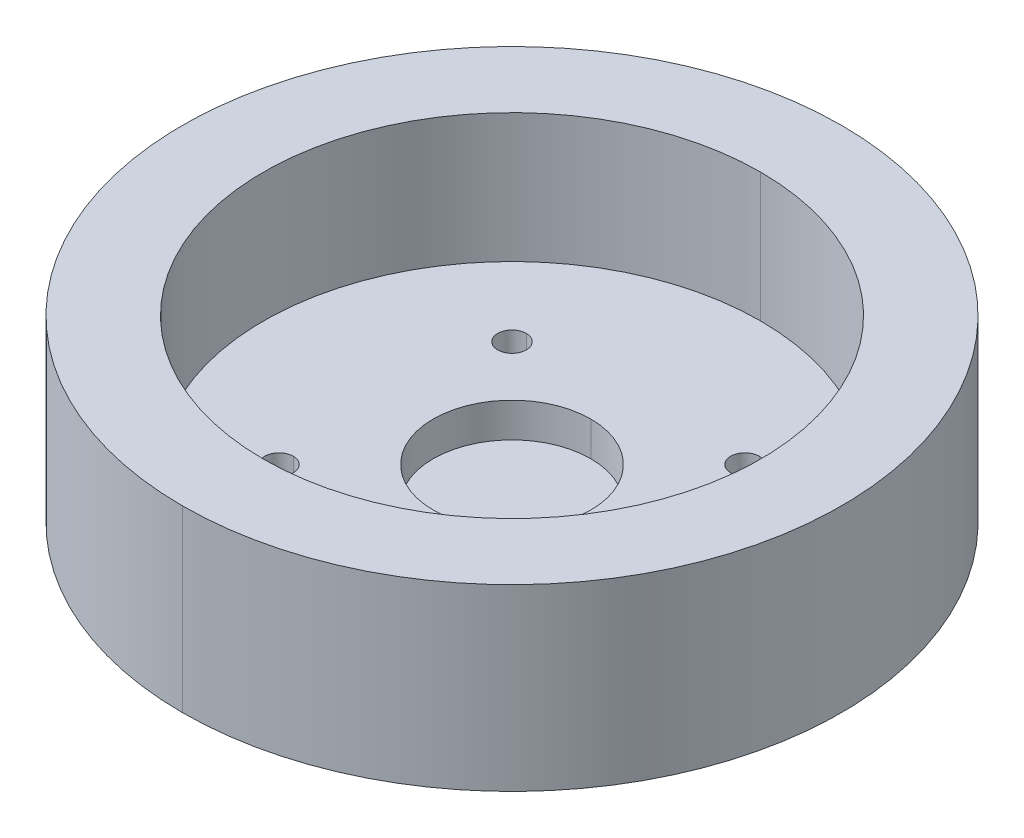
ISO-10303-21;
HEADER;
FILE_DESCRIPTION(('STEP AP214'),'2;1');
FILE_NAME('part.step','',(''),(''),'','','');
FILE_SCHEMA(('AUTOMOTIVE_DESIGN { 1 0 10303 214 1 1 1 1 }'));
ENDSEC;
DATA;
#1=APPLICATION_CONTEXT('core data for automotive mechanical design processes');
#2=APPLICATION_PROTOCOL_DEFINITION('international standard','automotive_design',2000,#1);
#3=PRODUCT_CONTEXT('',#1,'mechanical');
#4=PRODUCT('Part','Part','',(#3));
#5=PRODUCT_RELATED_PRODUCT_CATEGORY('part','',(#4));
#6=PRODUCT_DEFINITION_FORMATION('','',#4);
#7=PRODUCT_DEFINITION_CONTEXT('part definition',#1,'design');
#8=PRODUCT_DEFINITION('design','',#6,#7);
#9=PRODUCT_DEFINITION_SHAPE('','',#8);
#10=(LENGTH_UNIT() NAMED_UNIT(*) SI_UNIT(.MILLI.,.METRE.));
#11=(NAMED_UNIT(*) PLANE_ANGLE_UNIT() SI_UNIT($,.RADIAN.));
#12=(NAMED_UNIT(*) SI_UNIT($,.STERADIAN.) SOLID_ANGLE_UNIT());
#13=UNCERTAINTY_MEASURE_WITH_UNIT(LENGTH_MEASURE(1.E-05),#10,'distance_accuracy_value','');
#14=(GEOMETRIC_REPRESENTATION_CONTEXT(3) GLOBAL_UNCERTAINTY_ASSIGNED_CONTEXT((#13)) GLOBAL_UNIT_ASSIGNED_CONTEXT((#10,
#11,#12)) REPRESENTATION_CONTEXT('',''));
#15=CARTESIAN_POINT('',(0.,0.,0.));
#16=DIRECTION('',(0.,0.,1.));
#17=DIRECTION('',(1.,0.,0.));
#18=AXIS2_PLACEMENT_3D('',#15,#16,#17);
#19=CARTESIAN_POINT('',(-7.42462120245874,-5.,-7.42462120245876));
#20=DIRECTION('',(0.,1.,0.));
#21=DIRECTION('',(0.,0.,1.));
#22=AXIS2_PLACEMENT_3D('',#19,#20,#21);
#23=CYLINDRICAL_SURFACE('',#22,1.);
#24=DIRECTION('',(0.,1.,0.));
#25=VECTOR('',#24,1.);
#26=CARTESIAN_POINT('',(-7.42462120245874,-5.,-8.42462120245876));
#27=LINE('',#26,#25);
#28=CARTESIAN_POINT('',(-7.42462120245874,0.,-8.42462120245876));
#29=VERTEX_POINT('',#28);
#30=CARTESIAN_POINT('',(-7.42462120245874,3.5,-8.42462120245876));
#31=VERTEX_POINT('',#30);
#32=EDGE_CURVE('E192',#29,#31,#27,.T.);
#33=ORIENTED_EDGE('',*,*,#32,.F.);
#34=CARTESIAN_POINT('',(-7.42462120245874,0.,-7.42462120245876));
#35=DIRECTION('',(0.,1.,0.));
#36=DIRECTION('',(0.,0.,1.));
#37=AXIS2_PLACEMENT_3D('',#34,#35,#36);
#38=CIRCLE('',#37,1.);
#39=CARTESIAN_POINT('',(-7.42462120245874,0.,-6.42462120245876));
#40=VERTEX_POINT('',#39);
#41=EDGE_CURVE('E150',#40,#29,#38,.T.);
#42=ORIENTED_EDGE('',*,*,#41,.F.);
#43=DIRECTION('',(0.,1.,0.));
#44=VECTOR('',#43,1.);
#45=CARTESIAN_POINT('',(-7.42462120245874,-5.,-6.42462120245876));
#46=LINE('',#45,#44);
#47=CARTESIAN_POINT('',(-7.42462120245874,3.5,-6.42462120245876));
#48=VERTEX_POINT('',#47);
#49=EDGE_CURVE('E166',#40,#48,#46,.T.);
#50=ORIENTED_EDGE('',*,*,#49,.T.);
#51=CARTESIAN_POINT('',(-7.42462120245874,3.5,-7.42462120245876));
#52=DIRECTION('',(0.,1.,0.));
#53=DIRECTION('',(0.,0.,1.));
#54=AXIS2_PLACEMENT_3D('',#51,#52,#53);
#55=CIRCLE('',#54,1.);
#56=EDGE_CURVE('E236',#48,#31,#55,.T.);
#57=ORIENTED_EDGE('',*,*,#56,.T.);
#58=EDGE_LOOP('',(#33,#42,#50,#57));
#59=FACE_BOUND('',#58,.T.);
#60=ADVANCED_FACE('F17',(#59),#23,.F.);
#61=CARTESIAN_POINT('',(-8.1317279836453,-5.,8.1317279836453));
#62=DIRECTION('',(0.,1.,0.));
#63=DIRECTION('',(0.,0.,1.));
#64=AXIS2_PLACEMENT_3D('',#61,#62,#63);
#65=CYLINDRICAL_SURFACE('',#64,1.);
#66=DIRECTION('',(0.,1.,0.));
#67=VECTOR('',#66,1.);
#68=CARTESIAN_POINT('',(-8.1317279836453,-5.,7.1317279836453));
#69=LINE('',#68,#67);
#70=CARTESIAN_POINT('',(-8.1317279836453,0.,7.1317279836453));
#71=VERTEX_POINT('',#70);
#72=CARTESIAN_POINT('',(-8.1317279836453,3.5,7.1317279836453));
#73=VERTEX_POINT('',#72);
#74=EDGE_CURVE('E153',#71,#73,#69,.T.);
#75=ORIENTED_EDGE('',*,*,#74,.F.);
#76=CARTESIAN_POINT('',(-8.1317279836453,0.,8.1317279836453));
#77=DIRECTION('',(0.,1.,0.));
#78=DIRECTION('',(0.,0.,1.));
#79=AXIS2_PLACEMENT_3D('',#76,#77,#78);
#80=CIRCLE('',#79,1.);
#81=CARTESIAN_POINT('',(-8.1317279836453,0.,9.1317279836453));
#82=VERTEX_POINT('',#81);
#83=EDGE_CURVE('E139',#82,#71,#80,.T.);
#84=ORIENTED_EDGE('',*,*,#83,.F.);
#85=DIRECTION('',(0.,1.,0.));
#86=VECTOR('',#85,1.);
#87=CARTESIAN_POINT('',(-8.1317279836453,-5.,9.1317279836453));
#88=LINE('',#87,#86);
#89=CARTESIAN_POINT('',(-8.1317279836453,3.5,9.1317279836453));
#90=VERTEX_POINT('',#89);
#91=EDGE_CURVE('E164',#82,#90,#88,.T.);
#92=ORIENTED_EDGE('',*,*,#91,.T.);
#93=CARTESIAN_POINT('',(-8.1317279836453,3.5,8.1317279836453));
#94=DIRECTION('',(0.,1.,0.));
#95=DIRECTION('',(0.,0.,1.));
#96=AXIS2_PLACEMENT_3D('',#93,#94,#95);
#97=CIRCLE('',#96,1.);
#98=EDGE_CURVE('E156',#90,#73,#97,.T.);
#99=ORIENTED_EDGE('',*,*,#98,.T.);
#100=EDGE_LOOP('',(#75,#84,#92,#99));
#101=FACE_BOUND('',#100,.T.);
#102=ADVANCED_FACE('F154',(#101),#65,.F.);
#103=CARTESIAN_POINT('',(7.42462120245875,-5.,7.42462120245875));
#104=DIRECTION('',(0.,1.,0.));
#105=DIRECTION('',(0.,0.,1.));
#106=AXIS2_PLACEMENT_3D('',#103,#104,#105);
#107=CYLINDRICAL_SURFACE('',#106,0.999999999982255);
#108=DIRECTION('',(0.,1.,0.));
#109=VECTOR('',#108,1.);
#110=CARTESIAN_POINT('',(7.42462120245875,-5.,6.4246212024765));
#111=LINE('',#110,#109);
#112=CARTESIAN_POINT('',(7.42462120245875,0.,6.4246212024765));
#113=VERTEX_POINT('',#112);
#114=CARTESIAN_POINT('',(7.42462120245875,3.5,6.4246212024765));
#115=VERTEX_POINT('',#114);
#116=EDGE_CURVE('E217',#113,#115,#111,.T.);
#117=ORIENTED_EDGE('',*,*,#116,.F.);
#118=CARTESIAN_POINT('',(7.42462120245875,0.,7.42462120245875));
#119=DIRECTION('',(0.,1.,0.));
#120=DIRECTION('',(0.,0.,1.));
#121=AXIS2_PLACEMENT_3D('',#118,#119,#120);
#122=CIRCLE('',#121,0.999999999982255);
#123=CARTESIAN_POINT('',(7.42462120245875,0.,8.424621202441));
#124=VERTEX_POINT('',#123);
#125=EDGE_CURVE('E149',#124,#113,#122,.T.);
#126=ORIENTED_EDGE('',*,*,#125,.F.);
#127=DIRECTION('',(0.,1.,0.));
#128=VECTOR('',#127,1.);
#129=CARTESIAN_POINT('',(7.42462120245875,-5.,8.424621202441));
#130=LINE('',#129,#128);
#131=CARTESIAN_POINT('',(7.42462120245875,3.5,8.424621202441));
#132=VERTEX_POINT('',#131);
#133=EDGE_CURVE('E225',#124,#132,#130,.T.);
#134=ORIENTED_EDGE('',*,*,#133,.T.);
#135=CARTESIAN_POINT('',(7.42462120245875,3.5,7.42462120245875));
#136=DIRECTION('',(0.,1.,0.));
#137=DIRECTION('',(0.,0.,1.));
#138=AXIS2_PLACEMENT_3D('',#135,#136,#137);
#139=CIRCLE('',#138,0.999999999982255);
#140=EDGE_CURVE('E199',#132,#115,#139,.T.);
#141=ORIENTED_EDGE('',*,*,#140,.T.);
#142=EDGE_LOOP('',(#117,#126,#134,#141));
#143=FACE_BOUND('',#142,.T.);
#144=ADVANCED_FACE('F509',(#143),#107,.F.);
#145=CARTESIAN_POINT('',(8.1317279836453,-5.,-8.1317279836453));
#146=DIRECTION('',(0.,1.,0.));
#147=DIRECTION('',(0.,0.,1.));
#148=AXIS2_PLACEMENT_3D('',#145,#146,#147);
#149=CYLINDRICAL_SURFACE('',#148,1.);
#150=DIRECTION('',(0.,1.,0.));
#151=VECTOR('',#150,1.);
#152=CARTESIAN_POINT('',(8.1317279836453,-5.,-9.1317279836453));
#153=LINE('',#152,#151);
#154=CARTESIAN_POINT('',(8.1317279836453,0.,-9.1317279836453));
#155=VERTEX_POINT('',#154);
#156=CARTESIAN_POINT('',(8.1317279836453,3.5,-9.1317279836453));
#157=VERTEX_POINT('',#156);
#158=EDGE_CURVE('E184',#155,#157,#153,.T.);
#159=ORIENTED_EDGE('',*,*,#158,.F.);
#160=CARTESIAN_POINT('',(8.1317279836453,0.,-8.1317279836453));
#161=DIRECTION('',(0.,1.,0.));
#162=DIRECTION('',(0.,0.,1.));
#163=AXIS2_PLACEMENT_3D('',#160,#161,#162);
#164=CIRCLE('',#163,1.);
#165=CARTESIAN_POINT('',(8.1317279836453,0.,-7.13172798364529));
#166=VERTEX_POINT('',#165);
#167=EDGE_CURVE('E266',#166,#155,#164,.T.);
#168=ORIENTED_EDGE('',*,*,#167,.F.);
#169=DIRECTION('',(0.,1.,0.));
#170=VECTOR('',#169,1.);
#171=CARTESIAN_POINT('',(8.1317279836453,-5.,-7.13172798364529));
#172=LINE('',#171,#170);
#173=CARTESIAN_POINT('',(8.1317279836453,3.5,-7.13172798364529));
#174=VERTEX_POINT('',#173);
#175=EDGE_CURVE('E183',#166,#174,#172,.T.);
#176=ORIENTED_EDGE('',*,*,#175,.T.);
#177=CARTESIAN_POINT('',(8.1317279836453,3.5,-8.1317279836453));
#178=DIRECTION('',(0.,1.,0.));
#179=DIRECTION('',(0.,0.,1.));
#180=AXIS2_PLACEMENT_3D('',#177,#178,#179);
#181=CIRCLE('',#180,1.);
#182=EDGE_CURVE('E203',#174,#157,#181,.T.);
#183=ORIENTED_EDGE('',*,*,#182,.T.);
#184=EDGE_LOOP('',(#159,#168,#176,#183));
#185=FACE_BOUND('',#184,.T.);
#186=ADVANCED_FACE('F501',(#185),#149,.F.);
#187=CARTESIAN_POINT('',(0.,1.1,0.));
#188=DIRECTION('',(0.,1.,0.));
#189=DIRECTION('',(1.,0.,0.));
#190=AXIS2_PLACEMENT_3D('',#187,#188,#189);
#191=PLANE('',#190);
#192=CARTESIAN_POINT('',(0.,1.1,0.));
#193=DIRECTION('',(0.,1.,0.));
#194=DIRECTION('',(0.,0.,1.));
#195=AXIS2_PLACEMENT_3D('',#192,#193,#194);
#196=CIRCLE('',#195,5.5);
#197=CARTESIAN_POINT('',(0.,1.1,-5.5));
#198=VERTEX_POINT('',#197);
#199=CARTESIAN_POINT('',(0.,1.1,5.5));
#200=VERTEX_POINT('',#199);
#201=EDGE_CURVE('E230',#198,#200,#196,.T.);
#202=ORIENTED_EDGE('',*,*,#201,.T.);
#203=CARTESIAN_POINT('',(0.,1.1,0.));
#204=DIRECTION('',(0.,1.,0.));
#205=DIRECTION('',(0.,0.,1.));
#206=AXIS2_PLACEMENT_3D('',#203,#204,#205);
#207=CIRCLE('',#206,5.5);
#208=EDGE_CURVE('E42',#200,#198,#207,.T.);
#209=ORIENTED_EDGE('',*,*,#208,.T.);
#210=EDGE_LOOP('',(#202,#209));
#211=FACE_BOUND('',#210,.T.);
#212=ADVANCED_FACE('F321',(#211),#191,.T.);
#213=CARTESIAN_POINT('',(0.,12.5,0.));
#214=DIRECTION('',(0.,-1.,0.));
#215=DIRECTION('',(0.,0.,-1.));
#216=AXIS2_PLACEMENT_3D('',#213,#214,#215);
#217=CYLINDRICAL_SURFACE('',#216,17.35);
#218=DIRECTION('',(0.,-1.,0.));
#219=VECTOR('',#218,1.);
#220=CARTESIAN_POINT('',(0.,12.5,17.35));
#221=LINE('',#220,#219);
#222=CARTESIAN_POINT('',(0.,12.5,17.35));
#223=VERTEX_POINT('',#222);
#224=CARTESIAN_POINT('',(0.,3.5,17.35));
#225=VERTEX_POINT('',#224);
#226=EDGE_CURVE('E209',#223,#225,#221,.T.);
#227=ORIENTED_EDGE('',*,*,#226,.F.);
#228=CARTESIAN_POINT('',(0.,12.5,0.));
#229=DIRECTION('',(0.,1.,0.));
#230=DIRECTION('',(0.,0.,1.));
#231=AXIS2_PLACEMENT_3D('',#228,#229,#230);
#232=CIRCLE('',#231,17.35);
#233=CARTESIAN_POINT('',(0.,12.5,-17.35));
#234=VERTEX_POINT('',#233);
#235=EDGE_CURVE('E11',#223,#234,#232,.T.);
#236=ORIENTED_EDGE('',*,*,#235,.T.);
#237=DIRECTION('',(0.,-1.,0.));
#238=VECTOR('',#237,1.);
#239=CARTESIAN_POINT('',(0.,12.5,-17.35));
#240=LINE('',#239,#238);
#241=CARTESIAN_POINT('',(0.,3.5,-17.35));
#242=VERTEX_POINT('',#241);
#243=EDGE_CURVE('E249',#234,#242,#240,.T.);
#244=ORIENTED_EDGE('',*,*,#243,.T.);
#245=CARTESIAN_POINT('',(0.,3.5,0.));
#246=DIRECTION('',(0.,-1.,0.));
#247=DIRECTION('',(0.,0.,1.));
#248=AXIS2_PLACEMENT_3D('',#245,#246,#247);
#249=CIRCLE('',#248,17.35);
#250=EDGE_CURVE('E235',#242,#225,#249,.T.);
#251=ORIENTED_EDGE('',*,*,#250,.T.);
#252=EDGE_LOOP('',(#227,#236,#244,#251));
#253=FACE_BOUND('',#252,.T.);
#254=ADVANCED_FACE('F372',(#253),#217,.F.);
#255=CARTESIAN_POINT('',(0.,12.5,0.));
#256=DIRECTION('',(0.,-1.,0.));
#257=DIRECTION('',(0.,0.,-1.));
#258=AXIS2_PLACEMENT_3D('',#255,#256,#257);
#259=CYLINDRICAL_SURFACE('',#258,23.);
#260=DIRECTION('',(0.,-1.,0.));
#261=VECTOR('',#260,1.);
#262=CARTESIAN_POINT('',(0.,12.5,23.));
#263=LINE('',#262,#261);
#264=CARTESIAN_POINT('',(0.,12.5,23.));
#265=VERTEX_POINT('',#264);
#266=CARTESIAN_POINT('',(0.,0.,23.));
#267=VERTEX_POINT('',#266);
#268=EDGE_CURVE('E248',#265,#267,#263,.T.);
#269=ORIENTED_EDGE('',*,*,#268,.F.);
#270=CARTESIAN_POINT('',(0.,12.5,0.));
#271=DIRECTION('',(0.,1.,0.));
#272=DIRECTION('',(0.,0.,1.));
#273=AXIS2_PLACEMENT_3D('',#270,#271,#272);
#274=CIRCLE('',#273,23.);
#275=CARTESIAN_POINT('',(0.,12.5,-23.));
#276=VERTEX_POINT('',#275);
#277=EDGE_CURVE('E28',#276,#265,#274,.T.);
#278=ORIENTED_EDGE('',*,*,#277,.F.);
#279=DIRECTION('',(0.,-1.,0.));
#280=VECTOR('',#279,1.);
#281=CARTESIAN_POINT('',(0.,12.5,-23.));
#282=LINE('',#281,#280);
#283=CARTESIAN_POINT('',(0.,0.,-23.));
#284=VERTEX_POINT('',#283);
#285=EDGE_CURVE('E178',#276,#284,#282,.T.);
#286=ORIENTED_EDGE('',*,*,#285,.T.);
#287=CARTESIAN_POINT('',(0.,0.,0.));
#288=DIRECTION('',(0.,1.,0.));
#289=DIRECTION('',(0.,0.,1.));
#290=AXIS2_PLACEMENT_3D('',#287,#288,#289);
#291=CIRCLE('',#290,23.);
#292=EDGE_CURVE('E60',#284,#267,#291,.T.);
#293=ORIENTED_EDGE('',*,*,#292,.T.);
#294=EDGE_LOOP('',(#269,#278,#286,#293));
#295=FACE_BOUND('',#294,.T.);
#296=ADVANCED_FACE('F522',(#295),#259,.T.);
#297=CARTESIAN_POINT('',(0.,12.5,0.));
#298=DIRECTION('',(0.,1.,0.));
#299=DIRECTION('',(1.,0.,0.));
#300=AXIS2_PLACEMENT_3D('',#297,#298,#299);
#301=PLANE('',#300);
#302=CARTESIAN_POINT('',(0.,12.5,0.));
#303=DIRECTION('',(0.,1.,0.));
#304=DIRECTION('',(0.,0.,1.));
#305=AXIS2_PLACEMENT_3D('',#302,#303,#304);
#306=CIRCLE('',#305,17.35);
#307=EDGE_CURVE('E206',#234,#223,#306,.T.);
#308=ORIENTED_EDGE('',*,*,#307,.F.);
#309=ORIENTED_EDGE('',*,*,#235,.F.);
#310=EDGE_LOOP('',(#308,#309));
#311=FACE_BOUND('',#310,.T.);
#312=ORIENTED_EDGE('',*,*,#277,.T.);
#313=CARTESIAN_POINT('',(0.,12.5,0.));
#314=DIRECTION('',(0.,1.,0.));
#315=DIRECTION('',(0.,0.,1.));
#316=AXIS2_PLACEMENT_3D('',#313,#314,#315);
#317=CIRCLE('',#316,23.);
#318=EDGE_CURVE('E21',#265,#276,#317,.T.);
#319=ORIENTED_EDGE('',*,*,#318,.T.);
#320=EDGE_LOOP('',(#312,#319));
#321=FACE_BOUND('',#320,.T.);
#322=ADVANCED_FACE('F299',(#311,#321),#301,.T.);
#323=CARTESIAN_POINT('',(0.,3.5,0.));
#324=DIRECTION('',(0.,-1.,0.));
#325=DIRECTION('',(0.,0.,-1.));
#326=AXIS2_PLACEMENT_3D('',#323,#324,#325);
#327=CYLINDRICAL_SURFACE('',#326,5.5);
#328=DIRECTION('',(0.,-1.,0.));
#329=VECTOR('',#328,1.);
#330=CARTESIAN_POINT('',(0.,3.5,5.5));
#331=LINE('',#330,#329);
#332=CARTESIAN_POINT('',(0.,3.5,5.5));
#333=VERTEX_POINT('',#332);
#334=EDGE_CURVE('E226',#333,#200,#331,.T.);
#335=ORIENTED_EDGE('',*,*,#334,.F.);
#336=CARTESIAN_POINT('',(0.,3.5,0.));
#337=DIRECTION('',(0.,1.,0.));
#338=DIRECTION('',(0.,0.,1.));
#339=AXIS2_PLACEMENT_3D('',#336,#337,#338);
#340=CIRCLE('',#339,5.5);
#341=CARTESIAN_POINT('',(0.,3.5,-5.5));
#342=VERTEX_POINT('',#341);
#343=EDGE_CURVE('E195',#333,#342,#340,.T.);
#344=ORIENTED_EDGE('',*,*,#343,.T.);
#345=DIRECTION('',(0.,-1.,0.));
#346=VECTOR('',#345,1.);
#347=CARTESIAN_POINT('',(0.,3.5,-5.5));
#348=LINE('',#347,#346);
#349=EDGE_CURVE('E232',#342,#198,#348,.T.);
#350=ORIENTED_EDGE('',*,*,#349,.T.);
#351=ORIENTED_EDGE('',*,*,#208,.F.);
#352=EDGE_LOOP('',(#335,#344,#350,#351));
#353=FACE_BOUND('',#352,.T.);
#354=ADVANCED_FACE('F328',(#353),#327,.F.);
#355=CARTESIAN_POINT('',(0.,0.,0.));
#356=DIRECTION('',(0.,1.,0.));
#357=DIRECTION('',(1.,0.,0.));
#358=AXIS2_PLACEMENT_3D('',#355,#356,#357);
#359=PLANE('',#358);
#360=ORIENTED_EDGE('',*,*,#167,.T.);
#361=CARTESIAN_POINT('',(8.1317279836453,0.,-8.1317279836453));
#362=DIRECTION('',(0.,1.,0.));
#363=DIRECTION('',(0.,0.,1.));
#364=AXIS2_PLACEMENT_3D('',#361,#362,#363);
#365=CIRCLE('',#364,1.);
#366=EDGE_CURVE('E221',#155,#166,#365,.T.);
#367=ORIENTED_EDGE('',*,*,#366,.T.);
#368=EDGE_LOOP('',(#360,#367));
#369=FACE_BOUND('',#368,.T.);
#370=ORIENTED_EDGE('',*,*,#125,.T.);
#371=CARTESIAN_POINT('',(7.42462120245875,0.,7.42462120245875));
#372=DIRECTION('',(0.,1.,0.));
#373=DIRECTION('',(0.,0.,1.));
#374=AXIS2_PLACEMENT_3D('',#371,#372,#373);
#375=CIRCLE('',#374,0.999999999982255);
#376=EDGE_CURVE('E187',#113,#124,#375,.T.);
#377=ORIENTED_EDGE('',*,*,#376,.T.);
#378=EDGE_LOOP('',(#370,#377));
#379=FACE_BOUND('',#378,.T.);
#380=ORIENTED_EDGE('',*,*,#83,.T.);
#381=CARTESIAN_POINT('',(-8.1317279836453,0.,8.1317279836453));
#382=DIRECTION('',(0.,1.,0.));
#383=DIRECTION('',(0.,0.,1.));
#384=AXIS2_PLACEMENT_3D('',#381,#382,#383);
#385=CIRCLE('',#384,1.);
#386=EDGE_CURVE('E144',#71,#82,#385,.T.);
#387=ORIENTED_EDGE('',*,*,#386,.T.);
#388=EDGE_LOOP('',(#380,#387));
#389=FACE_BOUND('',#388,.T.);
#390=ORIENTED_EDGE('',*,*,#41,.T.);
#391=CARTESIAN_POINT('',(-7.42462120245874,0.,-7.42462120245876));
#392=DIRECTION('',(0.,1.,0.));
#393=DIRECTION('',(0.,0.,1.));
#394=AXIS2_PLACEMENT_3D('',#391,#392,#393);
#395=CIRCLE('',#394,1.);
#396=EDGE_CURVE('E188',#29,#40,#395,.T.);
#397=ORIENTED_EDGE('',*,*,#396,.T.);
#398=EDGE_LOOP('',(#390,#397));
#399=FACE_BOUND('',#398,.T.);
#400=ORIENTED_EDGE('',*,*,#292,.F.);
#401=CARTESIAN_POINT('',(0.,0.,0.));
#402=DIRECTION('',(0.,1.,0.));
#403=DIRECTION('',(0.,0.,1.));
#404=AXIS2_PLACEMENT_3D('',#401,#402,#403);
#405=CIRCLE('',#404,23.);
#406=EDGE_CURVE('E244',#267,#284,#405,.T.);
#407=ORIENTED_EDGE('',*,*,#406,.F.);
#408=EDGE_LOOP('',(#400,#407));
#409=FACE_BOUND('',#408,.T.);
#410=ADVANCED_FACE('F141',(#369,#379,#389,#399,#409),#359,.F.);
#411=CARTESIAN_POINT('',(0.,3.5,0.));
#412=DIRECTION('',(0.,1.,0.));
#413=DIRECTION('',(1.,0.,0.));
#414=AXIS2_PLACEMENT_3D('',#411,#412,#413);
#415=PLANE('',#414);
#416=CARTESIAN_POINT('',(0.,3.5,0.));
#417=DIRECTION('',(0.,1.,0.));
#418=DIRECTION('',(0.,0.,1.));
#419=AXIS2_PLACEMENT_3D('',#416,#417,#418);
#420=CIRCLE('',#419,5.5);
#421=EDGE_CURVE('E231',#342,#333,#420,.T.);
#422=ORIENTED_EDGE('',*,*,#421,.F.);
#423=ORIENTED_EDGE('',*,*,#343,.F.);
#424=EDGE_LOOP('',(#422,#423));
#425=FACE_BOUND('',#424,.T.);
#426=ORIENTED_EDGE('',*,*,#182,.F.);
#427=CARTESIAN_POINT('',(8.1317279836453,3.5,-8.1317279836453));
#428=DIRECTION('',(0.,1.,0.));
#429=DIRECTION('',(0.,0.,1.));
#430=AXIS2_PLACEMENT_3D('',#427,#428,#429);
#431=CIRCLE('',#430,1.);
#432=EDGE_CURVE('E180',#157,#174,#431,.T.);
#433=ORIENTED_EDGE('',*,*,#432,.F.);
#434=EDGE_LOOP('',(#426,#433));
#435=FACE_BOUND('',#434,.T.);
#436=ORIENTED_EDGE('',*,*,#140,.F.);
#437=CARTESIAN_POINT('',(7.42462120245875,3.5,7.42462120245875));
#438=DIRECTION('',(0.,1.,0.));
#439=DIRECTION('',(0.,0.,1.));
#440=AXIS2_PLACEMENT_3D('',#437,#438,#439);
#441=CIRCLE('',#440,0.999999999982255);
#442=EDGE_CURVE('E261',#115,#132,#441,.T.);
#443=ORIENTED_EDGE('',*,*,#442,.F.);
#444=EDGE_LOOP('',(#436,#443));
#445=FACE_BOUND('',#444,.T.);
#446=ORIENTED_EDGE('',*,*,#98,.F.);
#447=CARTESIAN_POINT('',(-8.1317279836453,3.5,8.1317279836453));
#448=DIRECTION('',(0.,1.,0.));
#449=DIRECTION('',(0.,0.,1.));
#450=AXIS2_PLACEMENT_3D('',#447,#448,#449);
#451=CIRCLE('',#450,1.);
#452=EDGE_CURVE('E161',#73,#90,#451,.T.);
#453=ORIENTED_EDGE('',*,*,#452,.F.);
#454=EDGE_LOOP('',(#446,#453));
#455=FACE_BOUND('',#454,.T.);
#456=ORIENTED_EDGE('',*,*,#56,.F.);
#457=CARTESIAN_POINT('',(-7.42462120245874,3.5,-7.42462120245876));
#458=DIRECTION('',(0.,1.,0.));
#459=DIRECTION('',(0.,0.,1.));
#460=AXIS2_PLACEMENT_3D('',#457,#458,#459);
#461=CIRCLE('',#460,1.);
#462=EDGE_CURVE('E174',#31,#48,#461,.T.);
#463=ORIENTED_EDGE('',*,*,#462,.F.);
#464=EDGE_LOOP('',(#456,#463));
#465=FACE_BOUND('',#464,.T.);
#466=ORIENTED_EDGE('',*,*,#250,.F.);
#467=CARTESIAN_POINT('',(0.,3.5,0.));
#468=DIRECTION('',(0.,-1.,0.));
#469=DIRECTION('',(0.,0.,1.));
#470=AXIS2_PLACEMENT_3D('',#467,#468,#469);
#471=CIRCLE('',#470,17.35);
#472=EDGE_CURVE('E253',#225,#242,#471,.T.);
#473=ORIENTED_EDGE('',*,*,#472,.F.);
#474=EDGE_LOOP('',(#466,#473));
#475=FACE_BOUND('',#474,.T.);
#476=ADVANCED_FACE('F363',(#425,#435,#445,#455,#465,#475),#415,.T.);
#477=CARTESIAN_POINT('',(0.,3.5,0.));
#478=DIRECTION('',(0.,-1.,0.));
#479=DIRECTION('',(0.,0.,-1.));
#480=AXIS2_PLACEMENT_3D('',#477,#478,#479);
#481=CYLINDRICAL_SURFACE('',#480,5.5);
#482=ORIENTED_EDGE('',*,*,#421,.T.);
#483=ORIENTED_EDGE('',*,*,#334,.T.);
#484=ORIENTED_EDGE('',*,*,#201,.F.);
#485=ORIENTED_EDGE('',*,*,#349,.F.);
#486=EDGE_LOOP('',(#482,#483,#484,#485));
#487=FACE_BOUND('',#486,.T.);
#488=ADVANCED_FACE('F325',(#487),#481,.F.);
#489=CARTESIAN_POINT('',(0.,12.5,0.));
#490=DIRECTION('',(0.,-1.,0.));
#491=DIRECTION('',(0.,0.,-1.));
#492=AXIS2_PLACEMENT_3D('',#489,#490,#491);
#493=CYLINDRICAL_SURFACE('',#492,23.);
#494=ORIENTED_EDGE('',*,*,#318,.F.);
#495=ORIENTED_EDGE('',*,*,#268,.T.);
#496=ORIENTED_EDGE('',*,*,#406,.T.);
#497=ORIENTED_EDGE('',*,*,#285,.F.);
#498=EDGE_LOOP('',(#494,#495,#496,#497));
#499=FACE_BOUND('',#498,.T.);
#500=ADVANCED_FACE('F301',(#499),#493,.T.);
#501=CARTESIAN_POINT('',(0.,12.5,0.));
#502=DIRECTION('',(0.,-1.,0.));
#503=DIRECTION('',(0.,0.,-1.));
#504=AXIS2_PLACEMENT_3D('',#501,#502,#503);
#505=CYLINDRICAL_SURFACE('',#504,17.35);
#506=ORIENTED_EDGE('',*,*,#307,.T.);
#507=ORIENTED_EDGE('',*,*,#226,.T.);
#508=ORIENTED_EDGE('',*,*,#472,.T.);
#509=ORIENTED_EDGE('',*,*,#243,.F.);
#510=EDGE_LOOP('',(#506,#507,#508,#509));
#511=FACE_BOUND('',#510,.T.);
#512=ADVANCED_FACE('F19',(#511),#505,.F.);
#513=CARTESIAN_POINT('',(8.1317279836453,-5.,-8.1317279836453));
#514=DIRECTION('',(0.,1.,0.));
#515=DIRECTION('',(0.,0.,1.));
#516=AXIS2_PLACEMENT_3D('',#513,#514,#515);
#517=CYLINDRICAL_SURFACE('',#516,1.);
#518=ORIENTED_EDGE('',*,*,#366,.F.);
#519=ORIENTED_EDGE('',*,*,#158,.T.);
#520=ORIENTED_EDGE('',*,*,#432,.T.);
#521=ORIENTED_EDGE('',*,*,#175,.F.);
#522=EDGE_LOOP('',(#518,#519,#520,#521));
#523=FACE_BOUND('',#522,.T.);
#524=ADVANCED_FACE('F489',(#523),#517,.F.);
#525=CARTESIAN_POINT('',(7.42462120245875,-5.,7.42462120245875));
#526=DIRECTION('',(0.,1.,0.));
#527=DIRECTION('',(0.,0.,1.));
#528=AXIS2_PLACEMENT_3D('',#525,#526,#527);
#529=CYLINDRICAL_SURFACE('',#528,0.999999999982255);
#530=ORIENTED_EDGE('',*,*,#376,.F.);
#531=ORIENTED_EDGE('',*,*,#116,.T.);
#532=ORIENTED_EDGE('',*,*,#442,.T.);
#533=ORIENTED_EDGE('',*,*,#133,.F.);
#534=EDGE_LOOP('',(#530,#531,#532,#533));
#535=FACE_BOUND('',#534,.T.);
#536=ADVANCED_FACE('F549',(#535),#529,.F.);
#537=CARTESIAN_POINT('',(-8.1317279836453,-5.,8.1317279836453));
#538=DIRECTION('',(0.,1.,0.));
#539=DIRECTION('',(0.,0.,1.));
#540=AXIS2_PLACEMENT_3D('',#537,#538,#539);
#541=CYLINDRICAL_SURFACE('',#540,1.);
#542=ORIENTED_EDGE('',*,*,#386,.F.);
#543=ORIENTED_EDGE('',*,*,#74,.T.);
#544=ORIENTED_EDGE('',*,*,#452,.T.);
#545=ORIENTED_EDGE('',*,*,#91,.F.);
#546=EDGE_LOOP('',(#542,#543,#544,#545));
#547=FACE_BOUND('',#546,.T.);
#548=ADVANCED_FACE('F163',(#547),#541,.F.);
#549=CARTESIAN_POINT('',(-7.42462120245874,-5.,-7.42462120245876));
#550=DIRECTION('',(0.,1.,0.));
#551=DIRECTION('',(0.,0.,1.));
#552=AXIS2_PLACEMENT_3D('',#549,#550,#551);
#553=CYLINDRICAL_SURFACE('',#552,1.);
#554=ORIENTED_EDGE('',*,*,#396,.F.);
#555=ORIENTED_EDGE('',*,*,#32,.T.);
#556=ORIENTED_EDGE('',*,*,#462,.T.);
#557=ORIENTED_EDGE('',*,*,#49,.F.);
#558=EDGE_LOOP('',(#554,#555,#556,#557));
#559=FACE_BOUND('',#558,.T.);
#560=ADVANCED_FACE('F548',(#559),#553,.F.);
#561=CLOSED_SHELL('',(#60,#102,#144,#186,#212,#254,#296,#322,#354,#410,#476,#488,#500,#512,#524,
#536,#548,#560));
#562=MANIFOLD_SOLID_BREP('B1',#561);
#563=ADVANCED_BREP_SHAPE_REPRESENTATION('',(#18,#562),#14);
#564=SHAPE_DEFINITION_REPRESENTATION(#9,#563);
ENDSEC;
END-ISO-10303-21;
